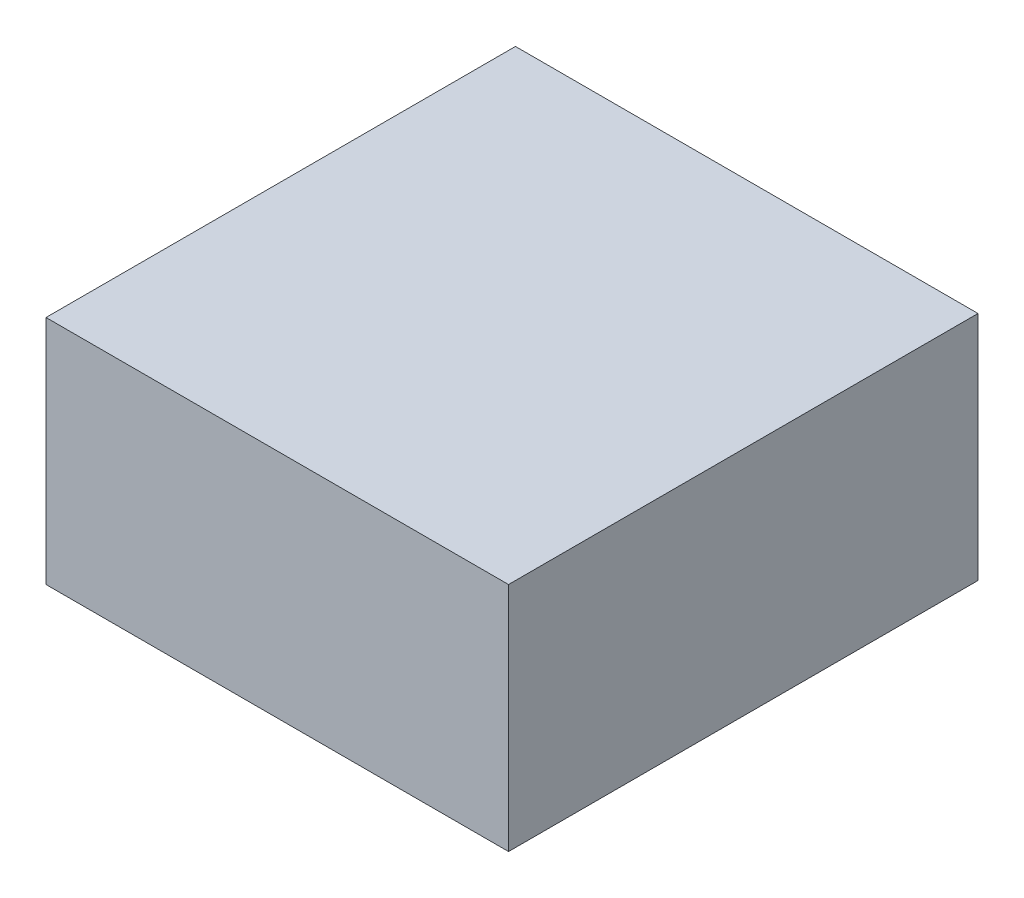
ISO-10303-21;
HEADER;
FILE_DESCRIPTION(('STEP AP214'),'2;1');
FILE_NAME('part.step','',(''),(''),'','','');
FILE_SCHEMA(('AUTOMOTIVE_DESIGN { 1 0 10303 214 1 1 1 1 }'));
ENDSEC;
DATA;
#1=APPLICATION_CONTEXT('core data for automotive mechanical design processes');
#2=APPLICATION_PROTOCOL_DEFINITION('international standard','automotive_design',2000,#1);
#3=PRODUCT_CONTEXT('',#1,'mechanical');
#4=PRODUCT('Part','Part','',(#3));
#5=PRODUCT_RELATED_PRODUCT_CATEGORY('part','',(#4));
#6=PRODUCT_DEFINITION_FORMATION('','',#4);
#7=PRODUCT_DEFINITION_CONTEXT('part definition',#1,'design');
#8=PRODUCT_DEFINITION('design','',#6,#7);
#9=PRODUCT_DEFINITION_SHAPE('','',#8);
#10=(LENGTH_UNIT() NAMED_UNIT(*) SI_UNIT(.MILLI.,.METRE.));
#11=(NAMED_UNIT(*) PLANE_ANGLE_UNIT() SI_UNIT($,.RADIAN.));
#12=(NAMED_UNIT(*) SI_UNIT($,.STERADIAN.) SOLID_ANGLE_UNIT());
#13=UNCERTAINTY_MEASURE_WITH_UNIT(LENGTH_MEASURE(1.E-05),#10,'distance_accuracy_value','');
#14=(GEOMETRIC_REPRESENTATION_CONTEXT(3) GLOBAL_UNCERTAINTY_ASSIGNED_CONTEXT((#13)) GLOBAL_UNIT_ASSIGNED_CONTEXT((#10,
#11,#12)) REPRESENTATION_CONTEXT('',''));
#15=CARTESIAN_POINT('',(0.,0.,0.));
#16=DIRECTION('',(0.,0.,1.));
#17=DIRECTION('',(1.,0.,0.));
#18=AXIS2_PLACEMENT_3D('',#15,#16,#17);
#19=CARTESIAN_POINT('',(-100.,50.,203.));
#20=DIRECTION('',(1.,0.,0.));
#21=DIRECTION('',(0.,1.,0.));
#22=AXIS2_PLACEMENT_3D('',#19,#20,#21);
#23=PLANE('',#22);
#24=DIRECTION('',(0.,-1.,0.));
#25=VECTOR('',#24,1.);
#26=CARTESIAN_POINT('',(-100.,50.,0.));
#27=LINE('',#26,#25);
#28=CARTESIAN_POINT('',(-100.,50.,0.));
#29=VERTEX_POINT('',#28);
#30=CARTESIAN_POINT('',(-100.,-50.,0.));
#31=VERTEX_POINT('',#30);
#32=EDGE_CURVE('E98',#29,#31,#27,.T.);
#33=ORIENTED_EDGE('',*,*,#32,.T.);
#34=DIRECTION('',(0.,0.,-1.));
#35=VECTOR('',#34,1.);
#36=CARTESIAN_POINT('',(-100.,-50.,203.));
#37=LINE('',#36,#35);
#38=CARTESIAN_POINT('',(-100.,-50.,203.));
#39=VERTEX_POINT('',#38);
#40=EDGE_CURVE('E11',#39,#31,#37,.T.);
#41=ORIENTED_EDGE('',*,*,#40,.F.);
#42=DIRECTION('',(0.,-1.,0.));
#43=VECTOR('',#42,1.);
#44=CARTESIAN_POINT('',(-100.,50.,203.));
#45=LINE('',#44,#43);
#46=CARTESIAN_POINT('',(-100.,50.,203.));
#47=VERTEX_POINT('',#46);
#48=EDGE_CURVE('E86',#47,#39,#45,.T.);
#49=ORIENTED_EDGE('',*,*,#48,.F.);
#50=DIRECTION('',(0.,0.,-1.));
#51=VECTOR('',#50,1.);
#52=CARTESIAN_POINT('',(-100.,50.,203.));
#53=LINE('',#52,#51);
#54=EDGE_CURVE('E94',#47,#29,#53,.T.);
#55=ORIENTED_EDGE('',*,*,#54,.T.);
#56=EDGE_LOOP('',(#33,#41,#49,#55));
#57=FACE_BOUND('',#56,.T.);
#58=ADVANCED_FACE('F35',(#57),#23,.F.);
#59=CARTESIAN_POINT('',(-100.,-50.,203.));
#60=DIRECTION('',(0.,1.,0.));
#61=DIRECTION('',(0.,0.,1.));
#62=AXIS2_PLACEMENT_3D('',#59,#60,#61);
#63=PLANE('',#62);
#64=DIRECTION('',(1.,0.,0.));
#65=VECTOR('',#64,1.);
#66=CARTESIAN_POINT('',(-100.,-50.,0.));
#67=LINE('',#66,#65);
#68=CARTESIAN_POINT('',(100.,-50.,0.));
#69=VERTEX_POINT('',#68);
#70=EDGE_CURVE('E90',#31,#69,#67,.T.);
#71=ORIENTED_EDGE('',*,*,#70,.T.);
#72=DIRECTION('',(0.,0.,-1.));
#73=VECTOR('',#72,1.);
#74=CARTESIAN_POINT('',(100.,-50.,203.));
#75=LINE('',#74,#73);
#76=CARTESIAN_POINT('',(100.,-50.,203.));
#77=VERTEX_POINT('',#76);
#78=EDGE_CURVE('E43',#77,#69,#75,.T.);
#79=ORIENTED_EDGE('',*,*,#78,.F.);
#80=DIRECTION('',(1.,0.,0.));
#81=VECTOR('',#80,1.);
#82=CARTESIAN_POINT('',(-100.,-50.,203.));
#83=LINE('',#82,#81);
#84=EDGE_CURVE('E81',#39,#77,#83,.T.);
#85=ORIENTED_EDGE('',*,*,#84,.F.);
#86=ORIENTED_EDGE('',*,*,#40,.T.);
#87=EDGE_LOOP('',(#71,#79,#85,#86));
#88=FACE_BOUND('',#87,.T.);
#89=ADVANCED_FACE('F89',(#88),#63,.F.);
#90=CARTESIAN_POINT('',(100.,50.,203.));
#91=DIRECTION('',(-1.,0.,0.));
#92=DIRECTION('',(0.,-1.,0.));
#93=AXIS2_PLACEMENT_3D('',#90,#91,#92);
#94=PLANE('',#93);
#95=DIRECTION('',(0.,1.,0.));
#96=VECTOR('',#95,1.);
#97=CARTESIAN_POINT('',(100.,50.,0.));
#98=LINE('',#97,#96);
#99=CARTESIAN_POINT('',(100.,50.,0.));
#100=VERTEX_POINT('',#99);
#101=EDGE_CURVE('E68',#69,#100,#98,.T.);
#102=ORIENTED_EDGE('',*,*,#101,.T.);
#103=DIRECTION('',(0.,0.,-1.));
#104=VECTOR('',#103,1.);
#105=CARTESIAN_POINT('',(100.,50.,203.));
#106=LINE('',#105,#104);
#107=CARTESIAN_POINT('',(100.,50.,203.));
#108=VERTEX_POINT('',#107);
#109=EDGE_CURVE('E91',#108,#100,#106,.T.);
#110=ORIENTED_EDGE('',*,*,#109,.F.);
#111=DIRECTION('',(0.,1.,0.));
#112=VECTOR('',#111,1.);
#113=CARTESIAN_POINT('',(100.,50.,203.));
#114=LINE('',#113,#112);
#115=EDGE_CURVE('E84',#77,#108,#114,.T.);
#116=ORIENTED_EDGE('',*,*,#115,.F.);
#117=ORIENTED_EDGE('',*,*,#78,.T.);
#118=EDGE_LOOP('',(#102,#110,#116,#117));
#119=FACE_BOUND('',#118,.T.);
#120=ADVANCED_FACE('F92',(#119),#94,.F.);
#121=CARTESIAN_POINT('',(-100.,50.,203.));
#122=DIRECTION('',(0.,-1.,0.));
#123=DIRECTION('',(0.,0.,-1.));
#124=AXIS2_PLACEMENT_3D('',#121,#122,#123);
#125=PLANE('',#124);
#126=DIRECTION('',(-1.,0.,0.));
#127=VECTOR('',#126,1.);
#128=CARTESIAN_POINT('',(-100.,50.,0.));
#129=LINE('',#128,#127);
#130=EDGE_CURVE('E74',#100,#29,#129,.T.);
#131=ORIENTED_EDGE('',*,*,#130,.T.);
#132=ORIENTED_EDGE('',*,*,#54,.F.);
#133=DIRECTION('',(-1.,0.,0.));
#134=VECTOR('',#133,1.);
#135=CARTESIAN_POINT('',(-100.,50.,203.));
#136=LINE('',#135,#134);
#137=EDGE_CURVE('E51',#108,#47,#136,.T.);
#138=ORIENTED_EDGE('',*,*,#137,.F.);
#139=ORIENTED_EDGE('',*,*,#109,.T.);
#140=EDGE_LOOP('',(#131,#132,#138,#139));
#141=FACE_BOUND('',#140,.T.);
#142=ADVANCED_FACE('F105',(#141),#125,.F.);
#143=CARTESIAN_POINT('',(0.,0.,203.));
#144=DIRECTION('',(0.,0.,1.));
#145=DIRECTION('',(1.,0.,0.));
#146=AXIS2_PLACEMENT_3D('',#143,#144,#145);
#147=PLANE('',#146);
#148=ORIENTED_EDGE('',*,*,#48,.T.);
#149=ORIENTED_EDGE('',*,*,#84,.T.);
#150=ORIENTED_EDGE('',*,*,#115,.T.);
#151=ORIENTED_EDGE('',*,*,#137,.T.);
#152=EDGE_LOOP('',(#148,#149,#150,#151));
#153=FACE_BOUND('',#152,.T.);
#154=ADVANCED_FACE('F82',(#153),#147,.T.);
#155=CARTESIAN_POINT('',(0.,0.,0.));
#156=DIRECTION('',(0.,0.,1.));
#157=DIRECTION('',(1.,0.,0.));
#158=AXIS2_PLACEMENT_3D('',#155,#156,#157);
#159=PLANE('',#158);
#160=ORIENTED_EDGE('',*,*,#32,.F.);
#161=ORIENTED_EDGE('',*,*,#130,.F.);
#162=ORIENTED_EDGE('',*,*,#101,.F.);
#163=ORIENTED_EDGE('',*,*,#70,.F.);
#164=EDGE_LOOP('',(#160,#161,#162,#163));
#165=FACE_BOUND('',#164,.T.);
#166=ADVANCED_FACE('F108',(#165),#159,.F.);
#167=CLOSED_SHELL('',(#58,#89,#120,#142,#154,#166));
#168=MANIFOLD_SOLID_BREP('B2',#167);
#169=ADVANCED_BREP_SHAPE_REPRESENTATION('',(#18,#168),#14);
#170=SHAPE_DEFINITION_REPRESENTATION(#9,#169);
ENDSEC;
END-ISO-10303-21;
